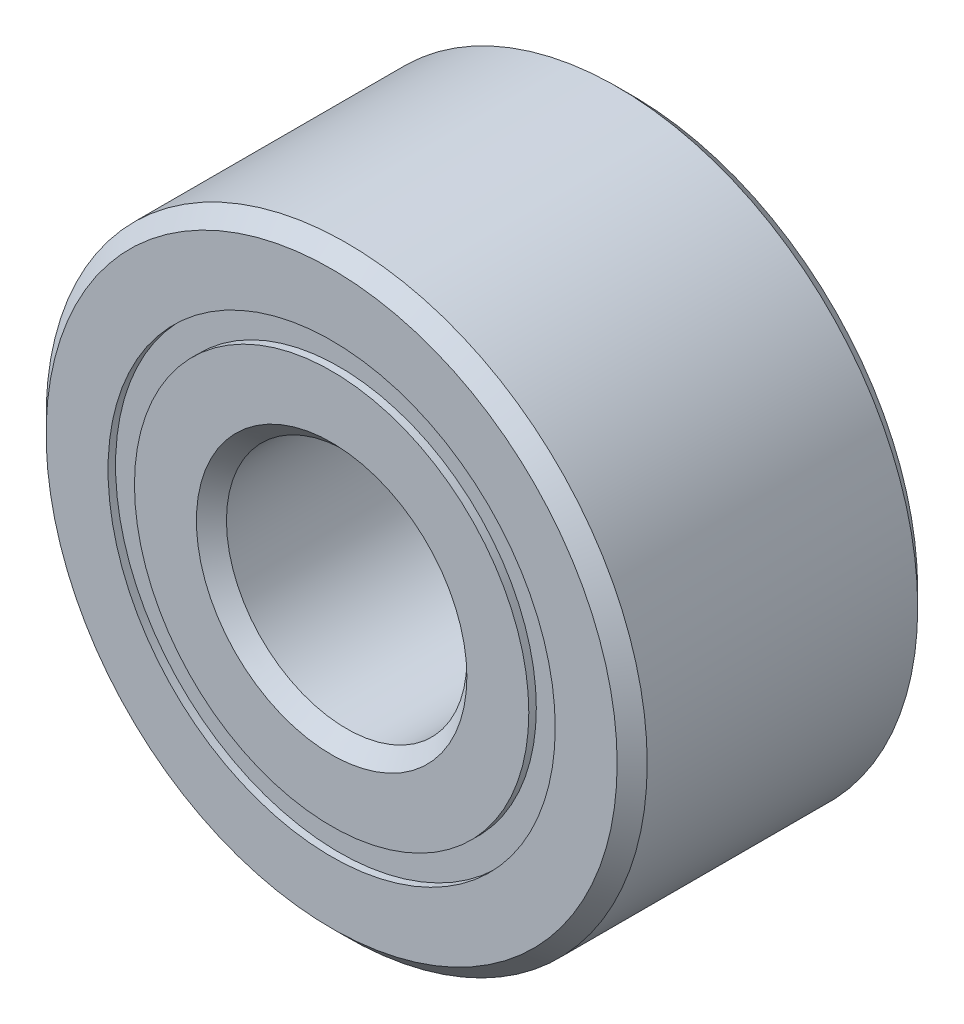
ISO-10303-21;
HEADER;
FILE_DESCRIPTION(('STEP AP214'),'2;1');
FILE_NAME('part.step','',(''),(''),'','','');
FILE_SCHEMA(('AUTOMOTIVE_DESIGN { 1 0 10303 214 1 1 1 1 }'));
ENDSEC;
DATA;
#1=APPLICATION_CONTEXT('core data for automotive mechanical design processes');
#2=APPLICATION_PROTOCOL_DEFINITION('international standard','automotive_design',2000,#1);
#3=PRODUCT_CONTEXT('',#1,'mechanical');
#4=PRODUCT('Part','Part','',(#3));
#5=PRODUCT_RELATED_PRODUCT_CATEGORY('part','',(#4));
#6=PRODUCT_DEFINITION_FORMATION('','',#4);
#7=PRODUCT_DEFINITION_CONTEXT('part definition',#1,'design');
#8=PRODUCT_DEFINITION('design','',#6,#7);
#9=PRODUCT_DEFINITION_SHAPE('','',#8);
#10=(LENGTH_UNIT() NAMED_UNIT(*) SI_UNIT(.MILLI.,.METRE.));
#11=(NAMED_UNIT(*) PLANE_ANGLE_UNIT() SI_UNIT($,.RADIAN.));
#12=(NAMED_UNIT(*) SI_UNIT($,.STERADIAN.) SOLID_ANGLE_UNIT());
#13=UNCERTAINTY_MEASURE_WITH_UNIT(LENGTH_MEASURE(1.E-05),#10,'distance_accuracy_value','');
#14=(GEOMETRIC_REPRESENTATION_CONTEXT(3) GLOBAL_UNCERTAINTY_ASSIGNED_CONTEXT((#13)) GLOBAL_UNIT_ASSIGNED_CONTEXT((#10,
#11,#12)) REPRESENTATION_CONTEXT('',''));
#15=CARTESIAN_POINT('',(0.,0.,0.));
#16=DIRECTION('',(0.,0.,1.));
#17=DIRECTION('',(1.,0.,0.));
#18=AXIS2_PLACEMENT_3D('',#15,#16,#17);
#19=CARTESIAN_POINT('',(0.,1.85989010989011,-1.1875));
#20=DIRECTION('',(0.,0.,1.));
#21=DIRECTION('',(1.,0.,0.));
#22=AXIS2_PLACEMENT_3D('',#19,#20,#21);
#23=PLANE('',#22);
#24=CARTESIAN_POINT('',(0.,0.,-1.1875));
#25=DIRECTION('',(0.,0.,1.));
#26=DIRECTION('',(1.,0.,0.));
#27=AXIS2_PLACEMENT_3D('',#24,#25,#26);
#28=CIRCLE('',#27,1.85989010989011);
#29=CARTESIAN_POINT('',(1.85989010989011,0.,-1.1875));
#30=VERTEX_POINT('',#29);
#31=EDGE_CURVE('E55',#30,#30,#28,.T.);
#32=ORIENTED_EDGE('',*,*,#31,.F.);
#33=EDGE_LOOP('',(#32));
#34=FACE_BOUND('',#33,.T.);
#35=CARTESIAN_POINT('',(0.,0.,-1.1875));
#36=DIRECTION('',(0.,0.,1.));
#37=DIRECTION('',(1.,0.,0.));
#38=AXIS2_PLACEMENT_3D('',#35,#36,#37);
#39=CIRCLE('',#38,1.64010989010989);
#40=CARTESIAN_POINT('',(1.64010989010989,0.,-1.1875));
#41=VERTEX_POINT('',#40);
#42=EDGE_CURVE('E11',#41,#41,#39,.T.);
#43=ORIENTED_EDGE('',*,*,#42,.T.);
#44=EDGE_LOOP('',(#43));
#45=FACE_BOUND('',#44,.T.);
#46=ADVANCED_FACE('F41',(#34,#45),#23,.F.);
#47=CARTESIAN_POINT('',(0.,0.,1.25));
#48=DIRECTION('',(0.,0.,1.));
#49=DIRECTION('',(1.,0.,0.));
#50=AXIS2_PLACEMENT_3D('',#47,#48,#49);
#51=CYLINDRICAL_SURFACE('',#50,1.64010989010989);
#52=ORIENTED_EDGE('',*,*,#42,.F.);
#53=EDGE_LOOP('',(#52));
#54=FACE_BOUND('',#53,.T.);
#55=CARTESIAN_POINT('',(0.,0.,-0.566319531325119));
#56=DIRECTION('',(0.,0.,1.));
#57=DIRECTION('',(1.,0.,0.));
#58=AXIS2_PLACEMENT_3D('',#55,#56,#57);
#59=CIRCLE('',#58,1.64010989010989);
#60=CARTESIAN_POINT('',(1.64010989010989,0.,-0.566319531325119));
#61=VERTEX_POINT('',#60);
#62=EDGE_CURVE('E47',#61,#61,#59,.T.);
#63=ORIENTED_EDGE('',*,*,#62,.T.);
#64=EDGE_LOOP('',(#63));
#65=FACE_BOUND('',#64,.T.);
#66=ADVANCED_FACE('F64',(#54,#65),#51,.F.);
#67=CARTESIAN_POINT('',(0.,1.85989010989011,-0.566319531325119));
#68=DIRECTION('',(0.,0.,-1.));
#69=DIRECTION('',(-1.,0.,0.));
#70=AXIS2_PLACEMENT_3D('',#67,#68,#69);
#71=PLANE('',#70);
#72=ORIENTED_EDGE('',*,*,#62,.F.);
#73=EDGE_LOOP('',(#72));
#74=FACE_BOUND('',#73,.T.);
#75=CARTESIAN_POINT('',(0.,0.,-0.566319531325119));
#76=DIRECTION('',(0.,0.,1.));
#77=DIRECTION('',(1.,0.,0.));
#78=AXIS2_PLACEMENT_3D('',#75,#76,#77);
#79=CIRCLE('',#78,1.85989010989011);
#80=CARTESIAN_POINT('',(1.85989010989011,0.,-0.566319531325119));
#81=VERTEX_POINT('',#80);
#82=EDGE_CURVE('E51',#81,#81,#79,.T.);
#83=ORIENTED_EDGE('',*,*,#82,.T.);
#84=EDGE_LOOP('',(#83));
#85=FACE_BOUND('',#84,.T.);
#86=ADVANCED_FACE('F68',(#74,#85),#71,.F.);
#87=CARTESIAN_POINT('',(0.,0.,1.25));
#88=DIRECTION('',(0.,0.,1.));
#89=DIRECTION('',(1.,0.,0.));
#90=AXIS2_PLACEMENT_3D('',#87,#88,#89);
#91=CYLINDRICAL_SURFACE('',#90,1.85989010989011);
#92=ORIENTED_EDGE('',*,*,#82,.F.);
#93=EDGE_LOOP('',(#92));
#94=FACE_BOUND('',#93,.T.);
#95=ORIENTED_EDGE('',*,*,#31,.T.);
#96=EDGE_LOOP('',(#95));
#97=FACE_BOUND('',#96,.T.);
#98=ADVANCED_FACE('F61',(#94,#97),#91,.T.);
#99=CLOSED_SHELL('',(#46,#66,#86,#98));
#100=MANIFOLD_SOLID_BREP('B2',#99);
#101=CARTESIAN_POINT('',(0.,1.85989010989011,1.1875));
#102=DIRECTION('',(0.,0.,-1.));
#103=DIRECTION('',(-1.,0.,0.));
#104=AXIS2_PLACEMENT_3D('',#101,#102,#103);
#105=PLANE('',#104);
#106=CARTESIAN_POINT('',(0.,0.,1.1875));
#107=DIRECTION('',(0.,0.,1.));
#108=DIRECTION('',(1.,0.,0.));
#109=AXIS2_PLACEMENT_3D('',#106,#107,#108);
#110=CIRCLE('',#109,1.64010989010989);
#111=CARTESIAN_POINT('',(1.64010989010989,0.,1.1875));
#112=VERTEX_POINT('',#111);
#113=EDGE_CURVE('E40',#112,#112,#110,.T.);
#114=ORIENTED_EDGE('',*,*,#113,.F.);
#115=EDGE_LOOP('',(#114));
#116=FACE_BOUND('',#115,.T.);
#117=CARTESIAN_POINT('',(0.,0.,1.1875));
#118=DIRECTION('',(0.,0.,1.));
#119=DIRECTION('',(1.,0.,0.));
#120=AXIS2_PLACEMENT_3D('',#117,#118,#119);
#121=CIRCLE('',#120,1.85989010989011);
#122=CARTESIAN_POINT('',(1.85989010989011,0.,1.1875));
#123=VERTEX_POINT('',#122);
#124=EDGE_CURVE('E122',#123,#123,#121,.T.);
#125=ORIENTED_EDGE('',*,*,#124,.T.);
#126=EDGE_LOOP('',(#125));
#127=FACE_BOUND('',#126,.T.);
#128=ADVANCED_FACE('F108',(#116,#127),#105,.F.);
#129=CARTESIAN_POINT('',(0.,0.,1.25));
#130=DIRECTION('',(0.,0.,1.));
#131=DIRECTION('',(1.,0.,0.));
#132=AXIS2_PLACEMENT_3D('',#129,#130,#131);
#133=CYLINDRICAL_SURFACE('',#132,1.64010989010989);
#134=CARTESIAN_POINT('',(0.,0.,0.566319531325118));
#135=DIRECTION('',(0.,0.,1.));
#136=DIRECTION('',(1.,0.,0.));
#137=AXIS2_PLACEMENT_3D('',#134,#135,#136);
#138=CIRCLE('',#137,1.64010989010989);
#139=CARTESIAN_POINT('',(1.64010989010989,0.,0.566319531325118));
#140=VERTEX_POINT('',#139);
#141=EDGE_CURVE('E114',#140,#140,#138,.T.);
#142=ORIENTED_EDGE('',*,*,#141,.F.);
#143=EDGE_LOOP('',(#142));
#144=FACE_BOUND('',#143,.T.);
#145=ORIENTED_EDGE('',*,*,#113,.T.);
#146=EDGE_LOOP('',(#145));
#147=FACE_BOUND('',#146,.T.);
#148=ADVANCED_FACE('F137',(#144,#147),#133,.F.);
#149=CARTESIAN_POINT('',(0.,1.85989010989011,0.566319531325118));
#150=DIRECTION('',(0.,0.,1.));
#151=DIRECTION('',(1.,0.,0.));
#152=AXIS2_PLACEMENT_3D('',#149,#150,#151);
#153=PLANE('',#152);
#154=CARTESIAN_POINT('',(0.,0.,0.566319531325118));
#155=DIRECTION('',(0.,0.,1.));
#156=DIRECTION('',(1.,0.,0.));
#157=AXIS2_PLACEMENT_3D('',#154,#155,#156);
#158=CIRCLE('',#157,1.85989010989011);
#159=CARTESIAN_POINT('',(1.85989010989011,0.,0.566319531325118));
#160=VERTEX_POINT('',#159);
#161=EDGE_CURVE('E118',#160,#160,#158,.T.);
#162=ORIENTED_EDGE('',*,*,#161,.F.);
#163=EDGE_LOOP('',(#162));
#164=FACE_BOUND('',#163,.T.);
#165=ORIENTED_EDGE('',*,*,#141,.T.);
#166=EDGE_LOOP('',(#165));
#167=FACE_BOUND('',#166,.T.);
#168=ADVANCED_FACE('F132',(#164,#167),#153,.F.);
#169=CARTESIAN_POINT('',(0.,0.,1.25));
#170=DIRECTION('',(0.,0.,1.));
#171=DIRECTION('',(1.,0.,0.));
#172=AXIS2_PLACEMENT_3D('',#169,#170,#171);
#173=CYLINDRICAL_SURFACE('',#172,1.85989010989011);
#174=ORIENTED_EDGE('',*,*,#124,.F.);
#175=EDGE_LOOP('',(#174));
#176=FACE_BOUND('',#175,.T.);
#177=ORIENTED_EDGE('',*,*,#161,.T.);
#178=EDGE_LOOP('',(#177));
#179=FACE_BOUND('',#178,.T.);
#180=ADVANCED_FACE('F129',(#176,#179),#173,.T.);
#181=CLOSED_SHELL('',(#128,#148,#168,#180));
#182=MANIFOLD_SOLID_BREP('B6',#181);
#183=CARTESIAN_POINT('',(-0.874999999999981,1.51554445662278,0.));
#184=DIRECTION('',(0.,0.,1.));
#185=DIRECTION('',(-0.499999999999989,0.866025403784445,0.));
#186=AXIS2_PLACEMENT_3D('',#183,#184,#185);
#187=SPHERICAL_SURFACE('',#186,0.566319531325119);
#188=CARTESIAN_POINT('',(-0.874999999999981,1.51554445662278,0.566319531325118));
#189=VERTEX_POINT('',#188);
#190=VERTEX_LOOP('',#189);
#191=FACE_BOUND('',#190,.T.);
#192=ADVANCED_FACE('F175',(#191),#187,.T.);
#193=CLOSED_SHELL('',(#192));
#194=MANIFOLD_SOLID_BREP('B35',#193);
#195=CARTESIAN_POINT('',(-1.51554445662276,0.875000000000018,0.));
#196=DIRECTION('',(0.,0.,1.));
#197=DIRECTION('',(-0.866025403784433,0.50000000000001,0.));
#198=AXIS2_PLACEMENT_3D('',#195,#196,#197);
#199=SPHERICAL_SURFACE('',#198,0.566319531325119);
#200=CARTESIAN_POINT('',(-1.51554445662276,0.875000000000018,0.566319531325118));
#201=VERTEX_POINT('',#200);
#202=VERTEX_LOOP('',#201);
#203=FACE_BOUND('',#202,.T.);
#204=ADVANCED_FACE('F195',(#203),#199,.T.);
#205=CLOSED_SHELL('',(#204));
#206=MANIFOLD_SOLID_BREP('B104',#205);
#207=CARTESIAN_POINT('',(-1.75,0.,0.));
#208=DIRECTION('',(0.,0.,1.));
#209=DIRECTION('',(-1.,0.,0.));
#210=AXIS2_PLACEMENT_3D('',#207,#208,#209);
#211=SPHERICAL_SURFACE('',#210,0.566319531325119);
#212=CARTESIAN_POINT('',(-1.75,0.,0.566319531325118));
#213=VERTEX_POINT('',#212);
#214=VERTEX_LOOP('',#213);
#215=FACE_BOUND('',#214,.T.);
#216=ADVANCED_FACE('F215',(#215),#211,.T.);
#217=CLOSED_SHELL('',(#216));
#218=MANIFOLD_SOLID_BREP('B171',#217);
#219=CARTESIAN_POINT('',(-1.51554445662278,-0.874999999999986,0.));
#220=DIRECTION('',(0.,0.,1.));
#221=DIRECTION('',(-0.866025403784443,-0.499999999999992,0.));
#222=AXIS2_PLACEMENT_3D('',#219,#220,#221);
#223=SPHERICAL_SURFACE('',#222,0.566319531325119);
#224=CARTESIAN_POINT('',(-1.51554445662278,-0.874999999999986,0.566319531325118));
#225=VERTEX_POINT('',#224);
#226=VERTEX_LOOP('',#225);
#227=FACE_BOUND('',#226,.T.);
#228=ADVANCED_FACE('F235',(#227),#223,.T.);
#229=CLOSED_SHELL('',(#228));
#230=MANIFOLD_SOLID_BREP('B191',#229);
#231=CARTESIAN_POINT('',(-0.875000000000012,-1.51554445662276,0.));
#232=DIRECTION('',(0.,0.,1.));
#233=DIRECTION('',(-0.500000000000007,-0.866025403784435,0.));
#234=AXIS2_PLACEMENT_3D('',#231,#232,#233);
#235=SPHERICAL_SURFACE('',#234,0.566319531325119);
#236=CARTESIAN_POINT('',(-0.875000000000012,-1.51554445662276,0.566319531325118));
#237=VERTEX_POINT('',#236);
#238=VERTEX_LOOP('',#237);
#239=FACE_BOUND('',#238,.T.);
#240=ADVANCED_FACE('F255',(#239),#235,.T.);
#241=CLOSED_SHELL('',(#240));
#242=MANIFOLD_SOLID_BREP('B211',#241);
#243=CARTESIAN_POINT('',(0.,-1.75,0.));
#244=DIRECTION('',(0.,0.,1.));
#245=DIRECTION('',(0.,-1.,0.));
#246=AXIS2_PLACEMENT_3D('',#243,#244,#245);
#247=SPHERICAL_SURFACE('',#246,0.566319531325119);
#248=CARTESIAN_POINT('',(0.,-1.75,0.566319531325118));
#249=VERTEX_POINT('',#248);
#250=VERTEX_LOOP('',#249);
#251=FACE_BOUND('',#250,.T.);
#252=ADVANCED_FACE('F275',(#251),#247,.T.);
#253=CLOSED_SHELL('',(#252));
#254=MANIFOLD_SOLID_BREP('B231',#253);
#255=CARTESIAN_POINT('',(0.874999999999991,-1.51554445662277,0.));
#256=DIRECTION('',(0.,0.,1.));
#257=DIRECTION('',(0.499999999999995,-0.866025403784442,0.));
#258=AXIS2_PLACEMENT_3D('',#255,#256,#257);
#259=SPHERICAL_SURFACE('',#258,0.566319531325119);
#260=CARTESIAN_POINT('',(0.874999999999991,-1.51554445662277,0.566319531325118));
#261=VERTEX_POINT('',#260);
#262=VERTEX_LOOP('',#261);
#263=FACE_BOUND('',#262,.T.);
#264=ADVANCED_FACE('F295',(#263),#259,.T.);
#265=CLOSED_SHELL('',(#264));
#266=MANIFOLD_SOLID_BREP('B251',#265);
#267=CARTESIAN_POINT('',(1.51554445662276,-0.875000000000007,0.));
#268=DIRECTION('',(0.,0.,1.));
#269=DIRECTION('',(0.866025403784436,-0.500000000000004,0.));
#270=AXIS2_PLACEMENT_3D('',#267,#268,#269);
#271=SPHERICAL_SURFACE('',#270,0.566319531325119);
#272=CARTESIAN_POINT('',(1.51554445662276,-0.875000000000007,0.566319531325118));
#273=VERTEX_POINT('',#272);
#274=VERTEX_LOOP('',#273);
#275=FACE_BOUND('',#274,.T.);
#276=ADVANCED_FACE('F315',(#275),#271,.T.);
#277=CLOSED_SHELL('',(#276));
#278=MANIFOLD_SOLID_BREP('B271',#277);
#279=CARTESIAN_POINT('',(1.75,0.,0.));
#280=DIRECTION('',(0.,0.,1.));
#281=DIRECTION('',(1.,0.,0.));
#282=AXIS2_PLACEMENT_3D('',#279,#280,#281);
#283=SPHERICAL_SURFACE('',#282,0.566319531325119);
#284=CARTESIAN_POINT('',(1.75,0.,0.566319531325118));
#285=VERTEX_POINT('',#284);
#286=VERTEX_LOOP('',#285);
#287=FACE_BOUND('',#286,.T.);
#288=ADVANCED_FACE('F335',(#287),#283,.T.);
#289=CLOSED_SHELL('',(#288));
#290=MANIFOLD_SOLID_BREP('B291',#289);
#291=CARTESIAN_POINT('',(1.51554445662277,0.874999999999997,0.));
#292=DIRECTION('',(0.,0.,1.));
#293=DIRECTION('',(0.86602540378444,0.499999999999998,0.));
#294=AXIS2_PLACEMENT_3D('',#291,#292,#293);
#295=SPHERICAL_SURFACE('',#294,0.566319531325119);
#296=CARTESIAN_POINT('',(1.51554445662277,0.874999999999997,0.566319531325118));
#297=VERTEX_POINT('',#296);
#298=VERTEX_LOOP('',#297);
#299=FACE_BOUND('',#298,.T.);
#300=ADVANCED_FACE('F355',(#299),#295,.T.);
#301=CLOSED_SHELL('',(#300));
#302=MANIFOLD_SOLID_BREP('B311',#301);
#303=CARTESIAN_POINT('',(0.875000000000002,1.51554445662277,0.));
#304=DIRECTION('',(0.,0.,1.));
#305=DIRECTION('',(0.500000000000001,0.866025403784438,0.));
#306=AXIS2_PLACEMENT_3D('',#303,#304,#305);
#307=SPHERICAL_SURFACE('',#306,0.566319531325119);
#308=CARTESIAN_POINT('',(0.875000000000002,1.51554445662277,0.566319531325118));
#309=VERTEX_POINT('',#308);
#310=VERTEX_LOOP('',#309);
#311=FACE_BOUND('',#310,.T.);
#312=ADVANCED_FACE('F375',(#311),#307,.T.);
#313=CLOSED_SHELL('',(#312));
#314=MANIFOLD_SOLID_BREP('B331',#313);
#315=CARTESIAN_POINT('',(0.,1.75,0.));
#316=DIRECTION('',(0.,0.,1.));
#317=DIRECTION('',(0.,1.,0.));
#318=AXIS2_PLACEMENT_3D('',#315,#316,#317);
#319=SPHERICAL_SURFACE('',#318,0.566319531325119);
#320=CARTESIAN_POINT('',(0.,1.75,0.566319531325118));
#321=VERTEX_POINT('',#320);
#322=VERTEX_LOOP('',#321);
#323=FACE_BOUND('',#322,.T.);
#324=ADVANCED_FACE('F397',(#323),#319,.T.);
#325=CLOSED_SHELL('',(#324));
#326=MANIFOLD_SOLID_BREP('B351',#325);
#327=CARTESIAN_POINT('',(0.,1.64010989010989,1.25));
#328=DIRECTION('',(0.,0.,-1.));
#329=DIRECTION('',(-1.,0.,0.));
#330=AXIS2_PLACEMENT_3D('',#327,#328,#329);
#331=PLANE('',#330);
#332=CARTESIAN_POINT('',(0.,0.,1.25));
#333=DIRECTION('',(0.,0.,1.));
#334=DIRECTION('',(1.,0.,0.));
#335=AXIS2_PLACEMENT_3D('',#332,#333,#334);
#336=CIRCLE('',#335,1.125);
#337=CARTESIAN_POINT('',(1.125,0.,1.25));
#338=VERTEX_POINT('',#337);
#339=EDGE_CURVE('E444',#338,#338,#336,.T.);
#340=ORIENTED_EDGE('',*,*,#339,.F.);
#341=EDGE_LOOP('',(#340));
#342=FACE_BOUND('',#341,.T.);
#343=CARTESIAN_POINT('',(0.,0.,1.25));
#344=DIRECTION('',(0.,0.,1.));
#345=DIRECTION('',(1.,0.,0.));
#346=AXIS2_PLACEMENT_3D('',#343,#344,#345);
#347=CIRCLE('',#346,1.64010989010989);
#348=CARTESIAN_POINT('',(1.64010989010989,0.,1.25));
#349=VERTEX_POINT('',#348);
#350=EDGE_CURVE('E396',#349,#349,#347,.T.);
#351=ORIENTED_EDGE('',*,*,#350,.T.);
#352=EDGE_LOOP('',(#351));
#353=FACE_BOUND('',#352,.T.);
#354=ADVANCED_FACE('F416',(#342,#353),#331,.F.);
#355=CARTESIAN_POINT('',(0.,0.,1.25));
#356=DIRECTION('',(0.,0.,1.));
#357=DIRECTION('',(1.,0.,0.));
#358=AXIS2_PLACEMENT_3D('',#355,#356,#357);
#359=CYLINDRICAL_SURFACE('',#358,1.64010989010989);
#360=ORIENTED_EDGE('',*,*,#350,.F.);
#361=EDGE_LOOP('',(#360));
#362=FACE_BOUND('',#361,.T.);
#363=CARTESIAN_POINT('',(0.,0.,0.555555555555555));
#364=DIRECTION('',(0.,0.,1.));
#365=DIRECTION('',(1.,0.,0.));
#366=AXIS2_PLACEMENT_3D('',#363,#364,#365);
#367=CIRCLE('',#366,1.64010989010989);
#368=CARTESIAN_POINT('',(1.64010989010989,0.,0.555555555555555));
#369=VERTEX_POINT('',#368);
#370=EDGE_CURVE('E422',#369,#369,#367,.T.);
#371=ORIENTED_EDGE('',*,*,#370,.T.);
#372=EDGE_LOOP('',(#371));
#373=FACE_BOUND('',#372,.T.);
#374=ADVANCED_FACE('F451',(#362,#373),#359,.T.);
#375=CARTESIAN_POINT('',(0.,0.,0.));
#376=DIRECTION('',(0.,0.,1.));
#377=DIRECTION('',(1.,0.,0.));
#378=AXIS2_PLACEMENT_3D('',#375,#376,#377);
#379=TOROIDAL_SURFACE('',#378,1.75,0.566319531325118);
#380=ORIENTED_EDGE('',*,*,#370,.F.);
#381=EDGE_LOOP('',(#380));
#382=FACE_BOUND('',#381,.T.);
#383=CARTESIAN_POINT('',(0.,0.,-0.555555555555556));
#384=DIRECTION('',(0.,0.,1.));
#385=DIRECTION('',(1.,0.,0.));
#386=AXIS2_PLACEMENT_3D('',#383,#384,#385);
#387=CIRCLE('',#386,1.64010989010989);
#388=CARTESIAN_POINT('',(1.64010989010989,0.,-0.555555555555556));
#389=VERTEX_POINT('',#388);
#390=EDGE_CURVE('E426',#389,#389,#387,.T.);
#391=ORIENTED_EDGE('',*,*,#390,.T.);
#392=EDGE_LOOP('',(#391));
#393=FACE_BOUND('',#392,.T.);
#394=ADVANCED_FACE('F455',(#382,#393),#379,.F.);
#395=CARTESIAN_POINT('',(0.,0.,1.25));
#396=DIRECTION('',(0.,0.,1.));
#397=DIRECTION('',(1.,0.,0.));
#398=AXIS2_PLACEMENT_3D('',#395,#396,#397);
#399=CYLINDRICAL_SURFACE('',#398,1.64010989010989);
#400=ORIENTED_EDGE('',*,*,#390,.F.);
#401=EDGE_LOOP('',(#400));
#402=FACE_BOUND('',#401,.T.);
#403=CARTESIAN_POINT('',(0.,0.,-1.25));
#404=DIRECTION('',(0.,0.,1.));
#405=DIRECTION('',(1.,0.,0.));
#406=AXIS2_PLACEMENT_3D('',#403,#404,#405);
#407=CIRCLE('',#406,1.64010989010989);
#408=CARTESIAN_POINT('',(1.64010989010989,0.,-1.25));
#409=VERTEX_POINT('',#408);
#410=EDGE_CURVE('E430',#409,#409,#407,.T.);
#411=ORIENTED_EDGE('',*,*,#410,.T.);
#412=EDGE_LOOP('',(#411));
#413=FACE_BOUND('',#412,.T.);
#414=ADVANCED_FACE('F460',(#402,#413),#399,.T.);
#415=CARTESIAN_POINT('',(0.,1.125,-1.25));
#416=DIRECTION('',(0.,0.,1.));
#417=DIRECTION('',(1.,0.,0.));
#418=AXIS2_PLACEMENT_3D('',#415,#416,#417);
#419=PLANE('',#418);
#420=ORIENTED_EDGE('',*,*,#410,.F.);
#421=EDGE_LOOP('',(#420));
#422=FACE_BOUND('',#421,.T.);
#423=CARTESIAN_POINT('',(0.,0.,-1.25));
#424=DIRECTION('',(0.,0.,1.));
#425=DIRECTION('',(1.,0.,0.));
#426=AXIS2_PLACEMENT_3D('',#423,#424,#425);
#427=CIRCLE('',#426,1.125);
#428=CARTESIAN_POINT('',(1.125,0.,-1.25));
#429=VERTEX_POINT('',#428);
#430=EDGE_CURVE('E435',#429,#429,#427,.T.);
#431=ORIENTED_EDGE('',*,*,#430,.T.);
#432=EDGE_LOOP('',(#431));
#433=FACE_BOUND('',#432,.T.);
#434=ADVANCED_FACE('F466',(#422,#433),#419,.F.);
#435=CARTESIAN_POINT('',(0.,0.,-1.125));
#436=DIRECTION('',(0.,0.,-1.));
#437=DIRECTION('',(-1.,0.,0.));
#438=AXIS2_PLACEMENT_3D('',#435,#436,#437);
#439=CONICAL_SURFACE('',#438,1.,0.785398163397448);
#440=ORIENTED_EDGE('',*,*,#430,.F.);
#441=EDGE_LOOP('',(#440));
#442=FACE_BOUND('',#441,.T.);
#443=CARTESIAN_POINT('',(0.,0.,-1.125));
#444=DIRECTION('',(0.,0.,1.));
#445=DIRECTION('',(1.,0.,0.));
#446=AXIS2_PLACEMENT_3D('',#443,#444,#445);
#447=CIRCLE('',#446,1.);
#448=CARTESIAN_POINT('',(1.,0.,-1.125));
#449=VERTEX_POINT('',#448);
#450=EDGE_CURVE('E438',#449,#449,#447,.T.);
#451=ORIENTED_EDGE('',*,*,#450,.T.);
#452=EDGE_LOOP('',(#451));
#453=FACE_BOUND('',#452,.T.);
#454=ADVANCED_FACE('F470',(#442,#453),#439,.F.);
#455=CARTESIAN_POINT('',(0.,0.,1.25));
#456=DIRECTION('',(0.,0.,1.));
#457=DIRECTION('',(1.,0.,0.));
#458=AXIS2_PLACEMENT_3D('',#455,#456,#457);
#459=CYLINDRICAL_SURFACE('',#458,1.);
#460=ORIENTED_EDGE('',*,*,#450,.F.);
#461=EDGE_LOOP('',(#460));
#462=FACE_BOUND('',#461,.T.);
#463=CARTESIAN_POINT('',(0.,0.,1.125));
#464=DIRECTION('',(0.,0.,1.));
#465=DIRECTION('',(1.,0.,0.));
#466=AXIS2_PLACEMENT_3D('',#463,#464,#465);
#467=CIRCLE('',#466,1.);
#468=CARTESIAN_POINT('',(1.,0.,1.125));
#469=VERTEX_POINT('',#468);
#470=EDGE_CURVE('E441',#469,#469,#467,.T.);
#471=ORIENTED_EDGE('',*,*,#470,.T.);
#472=EDGE_LOOP('',(#471));
#473=FACE_BOUND('',#472,.T.);
#474=ADVANCED_FACE('F474',(#462,#473),#459,.F.);
#475=CARTESIAN_POINT('',(0.,0.,1.25));
#476=DIRECTION('',(0.,0.,1.));
#477=DIRECTION('',(1.,0.,0.));
#478=AXIS2_PLACEMENT_3D('',#475,#476,#477);
#479=CONICAL_SURFACE('',#478,1.125,0.785398163397447);
#480=ORIENTED_EDGE('',*,*,#470,.F.);
#481=EDGE_LOOP('',(#480));
#482=FACE_BOUND('',#481,.T.);
#483=ORIENTED_EDGE('',*,*,#339,.T.);
#484=EDGE_LOOP('',(#483));
#485=FACE_BOUND('',#484,.T.);
#486=ADVANCED_FACE('F448',(#482,#485),#479,.F.);
#487=CLOSED_SHELL('',(#354,#374,#394,#414,#434,#454,#474,#486));
#488=MANIFOLD_SOLID_BREP('B371',#487);
#489=CARTESIAN_POINT('',(0.,0.,1.125));
#490=DIRECTION('',(0.,0.,-1.));
#491=DIRECTION('',(-1.,0.,0.));
#492=AXIS2_PLACEMENT_3D('',#489,#490,#491);
#493=CONICAL_SURFACE('',#492,2.5,0.785398163397449);
#494=CARTESIAN_POINT('',(0.,0.,1.25));
#495=DIRECTION('',(0.,0.,1.));
#496=DIRECTION('',(1.,0.,0.));
#497=AXIS2_PLACEMENT_3D('',#494,#495,#496);
#498=CIRCLE('',#497,2.375);
#499=CARTESIAN_POINT('',(2.375,0.,1.25));
#500=VERTEX_POINT('',#499);
#501=EDGE_CURVE('E565',#500,#500,#498,.T.);
#502=ORIENTED_EDGE('',*,*,#501,.F.);
#503=EDGE_LOOP('',(#502));
#504=FACE_BOUND('',#503,.T.);
#505=CARTESIAN_POINT('',(0.,0.,1.125));
#506=DIRECTION('',(0.,0.,1.));
#507=DIRECTION('',(1.,0.,0.));
#508=AXIS2_PLACEMENT_3D('',#505,#506,#507);
#509=CIRCLE('',#508,2.5);
#510=CARTESIAN_POINT('',(2.5,0.,1.125));
#511=VERTEX_POINT('',#510);
#512=EDGE_CURVE('E415',#511,#511,#509,.T.);
#513=ORIENTED_EDGE('',*,*,#512,.T.);
#514=EDGE_LOOP('',(#513));
#515=FACE_BOUND('',#514,.T.);
#516=ADVANCED_FACE('F537',(#504,#515),#493,.T.);
#517=CARTESIAN_POINT('',(0.,0.,1.25));
#518=DIRECTION('',(0.,0.,1.));
#519=DIRECTION('',(1.,0.,0.));
#520=AXIS2_PLACEMENT_3D('',#517,#518,#519);
#521=CYLINDRICAL_SURFACE('',#520,2.5);
#522=ORIENTED_EDGE('',*,*,#512,.F.);
#523=EDGE_LOOP('',(#522));
#524=FACE_BOUND('',#523,.T.);
#525=CARTESIAN_POINT('',(0.,0.,-1.125));
#526=DIRECTION('',(0.,0.,1.));
#527=DIRECTION('',(1.,0.,0.));
#528=AXIS2_PLACEMENT_3D('',#525,#526,#527);
#529=CIRCLE('',#528,2.5);
#530=CARTESIAN_POINT('',(2.5,0.,-1.125));
#531=VERTEX_POINT('',#530);
#532=EDGE_CURVE('E543',#531,#531,#529,.T.);
#533=ORIENTED_EDGE('',*,*,#532,.T.);
#534=EDGE_LOOP('',(#533));
#535=FACE_BOUND('',#534,.T.);
#536=ADVANCED_FACE('F572',(#524,#535),#521,.T.);
#537=CARTESIAN_POINT('',(0.,0.,-1.25));
#538=DIRECTION('',(0.,0.,1.));
#539=DIRECTION('',(1.,0.,0.));
#540=AXIS2_PLACEMENT_3D('',#537,#538,#539);
#541=CONICAL_SURFACE('',#540,2.375,0.78539816339745);
#542=ORIENTED_EDGE('',*,*,#532,.F.);
#543=EDGE_LOOP('',(#542));
#544=FACE_BOUND('',#543,.T.);
#545=CARTESIAN_POINT('',(0.,0.,-1.25));
#546=DIRECTION('',(0.,0.,1.));
#547=DIRECTION('',(1.,0.,0.));
#548=AXIS2_PLACEMENT_3D('',#545,#546,#547);
#549=CIRCLE('',#548,2.375);
#550=CARTESIAN_POINT('',(2.375,0.,-1.25));
#551=VERTEX_POINT('',#550);
#552=EDGE_CURVE('E547',#551,#551,#549,.T.);
#553=ORIENTED_EDGE('',*,*,#552,.T.);
#554=EDGE_LOOP('',(#553));
#555=FACE_BOUND('',#554,.T.);
#556=ADVANCED_FACE('F576',(#544,#555),#541,.T.);
#557=CARTESIAN_POINT('',(0.,2.375,-1.25));
#558=DIRECTION('',(0.,0.,1.));
#559=DIRECTION('',(1.,0.,0.));
#560=AXIS2_PLACEMENT_3D('',#557,#558,#559);
#561=PLANE('',#560);
#562=ORIENTED_EDGE('',*,*,#552,.F.);
#563=EDGE_LOOP('',(#562));
#564=FACE_BOUND('',#563,.T.);
#565=CARTESIAN_POINT('',(0.,0.,-1.25));
#566=DIRECTION('',(0.,0.,1.));
#567=DIRECTION('',(1.,0.,0.));
#568=AXIS2_PLACEMENT_3D('',#565,#566,#567);
#569=CIRCLE('',#568,1.85989010989011);
#570=CARTESIAN_POINT('',(1.85989010989011,0.,-1.25));
#571=VERTEX_POINT('',#570);
#572=EDGE_CURVE('E551',#571,#571,#569,.T.);
#573=ORIENTED_EDGE('',*,*,#572,.T.);
#574=EDGE_LOOP('',(#573));
#575=FACE_BOUND('',#574,.T.);
#576=ADVANCED_FACE('F581',(#564,#575),#561,.F.);
#577=CARTESIAN_POINT('',(0.,0.,1.25));
#578=DIRECTION('',(0.,0.,1.));
#579=DIRECTION('',(1.,0.,0.));
#580=AXIS2_PLACEMENT_3D('',#577,#578,#579);
#581=CYLINDRICAL_SURFACE('',#580,1.85989010989011);
#582=ORIENTED_EDGE('',*,*,#572,.F.);
#583=EDGE_LOOP('',(#582));
#584=FACE_BOUND('',#583,.T.);
#585=CARTESIAN_POINT('',(0.,0.,-0.555555555555556));
#586=DIRECTION('',(0.,0.,1.));
#587=DIRECTION('',(1.,0.,0.));
#588=AXIS2_PLACEMENT_3D('',#585,#586,#587);
#589=CIRCLE('',#588,1.85989010989011);
#590=CARTESIAN_POINT('',(1.85989010989011,0.,-0.555555555555556));
#591=VERTEX_POINT('',#590);
#592=EDGE_CURVE('E556',#591,#591,#589,.T.);
#593=ORIENTED_EDGE('',*,*,#592,.T.);
#594=EDGE_LOOP('',(#593));
#595=FACE_BOUND('',#594,.T.);
#596=ADVANCED_FACE('F587',(#584,#595),#581,.F.);
#597=CARTESIAN_POINT('',(0.,0.,0.));
#598=DIRECTION('',(0.,0.,1.));
#599=DIRECTION('',(1.,0.,0.));
#600=AXIS2_PLACEMENT_3D('',#597,#598,#599);
#601=TOROIDAL_SURFACE('',#600,1.75,0.566319531325119);
#602=ORIENTED_EDGE('',*,*,#592,.F.);
#603=EDGE_LOOP('',(#602));
#604=FACE_BOUND('',#603,.T.);
#605=CARTESIAN_POINT('',(0.,0.,0.555555555555555));
#606=DIRECTION('',(0.,0.,1.));
#607=DIRECTION('',(1.,0.,0.));
#608=AXIS2_PLACEMENT_3D('',#605,#606,#607);
#609=CIRCLE('',#608,1.85989010989011);
#610=CARTESIAN_POINT('',(1.85989010989011,0.,0.555555555555555));
#611=VERTEX_POINT('',#610);
#612=EDGE_CURVE('E559',#611,#611,#609,.T.);
#613=ORIENTED_EDGE('',*,*,#612,.T.);
#614=EDGE_LOOP('',(#613));
#615=FACE_BOUND('',#614,.T.);
#616=ADVANCED_FACE('F591',(#604,#615),#601,.F.);
#617=CARTESIAN_POINT('',(0.,0.,1.25));
#618=DIRECTION('',(0.,0.,1.));
#619=DIRECTION('',(1.,0.,0.));
#620=AXIS2_PLACEMENT_3D('',#617,#618,#619);
#621=CYLINDRICAL_SURFACE('',#620,1.85989010989011);
#622=ORIENTED_EDGE('',*,*,#612,.F.);
#623=EDGE_LOOP('',(#622));
#624=FACE_BOUND('',#623,.T.);
#625=CARTESIAN_POINT('',(0.,0.,1.25));
#626=DIRECTION('',(0.,0.,1.));
#627=DIRECTION('',(1.,0.,0.));
#628=AXIS2_PLACEMENT_3D('',#625,#626,#627);
#629=CIRCLE('',#628,1.85989010989011);
#630=CARTESIAN_POINT('',(1.85989010989011,0.,1.25));
#631=VERTEX_POINT('',#630);
#632=EDGE_CURVE('E562',#631,#631,#629,.T.);
#633=ORIENTED_EDGE('',*,*,#632,.T.);
#634=EDGE_LOOP('',(#633));
#635=FACE_BOUND('',#634,.T.);
#636=ADVANCED_FACE('F595',(#624,#635),#621,.F.);
#637=CARTESIAN_POINT('',(0.,2.375,1.25));
#638=DIRECTION('',(0.,0.,-1.));
#639=DIRECTION('',(-1.,0.,0.));
#640=AXIS2_PLACEMENT_3D('',#637,#638,#639);
#641=PLANE('',#640);
#642=ORIENTED_EDGE('',*,*,#632,.F.);
#643=EDGE_LOOP('',(#642));
#644=FACE_BOUND('',#643,.T.);
#645=ORIENTED_EDGE('',*,*,#501,.T.);
#646=EDGE_LOOP('',(#645));
#647=FACE_BOUND('',#646,.T.);
#648=ADVANCED_FACE('F569',(#644,#647),#641,.F.);
#649=CLOSED_SHELL('',(#516,#536,#556,#576,#596,#616,#636,#648));
#650=MANIFOLD_SOLID_BREP('B391',#649);
#651=ADVANCED_BREP_SHAPE_REPRESENTATION('',(#18,#100,#182,#194,#206,#218,#230,#242,#254,#266,
#278,#290,#302,#314,#326,#488,#650),#14);
#652=SHAPE_DEFINITION_REPRESENTATION(#9,#651);
ENDSEC;
END-ISO-10303-21;
